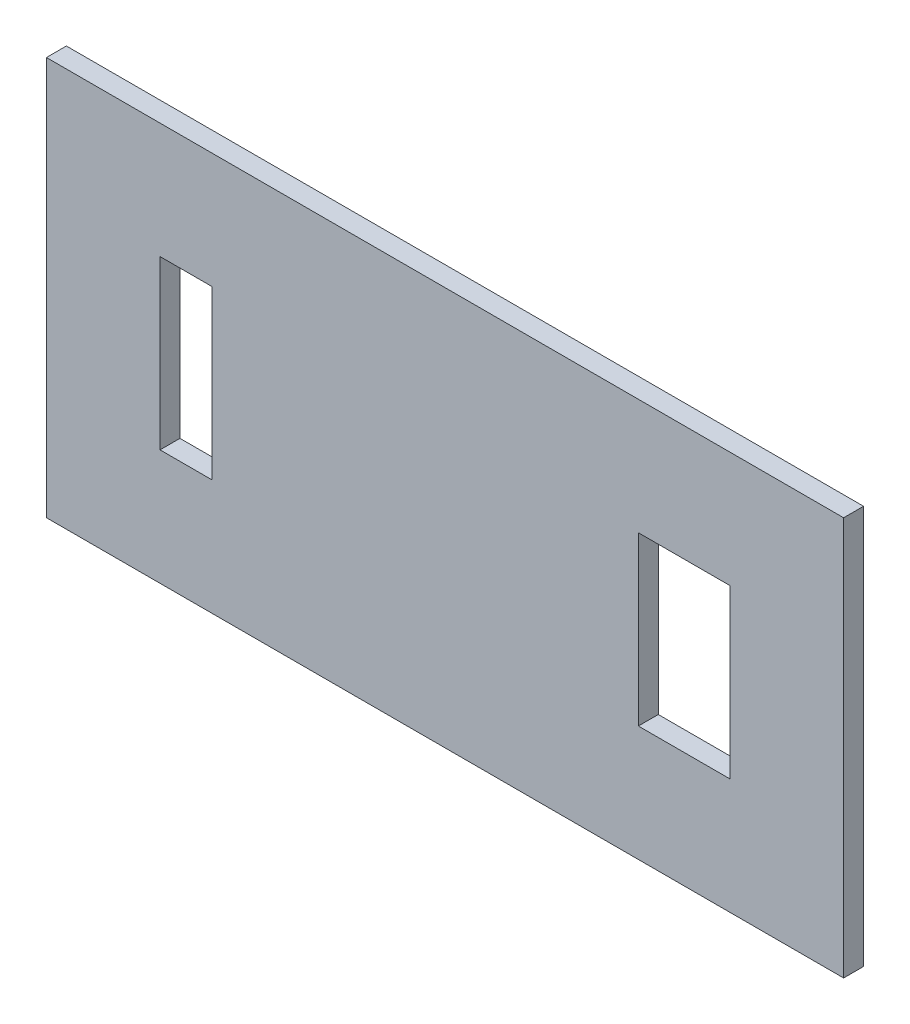
ISO-10303-21;
HEADER;
FILE_DESCRIPTION(('STEP AP214'),'2;1');
FILE_NAME('part.step','',(''),(''),'','','');
FILE_SCHEMA(('AUTOMOTIVE_DESIGN { 1 0 10303 214 1 1 1 1 }'));
ENDSEC;
DATA;
#1=APPLICATION_CONTEXT('core data for automotive mechanical design processes');
#2=APPLICATION_PROTOCOL_DEFINITION('international standard','automotive_design',2000,#1);
#3=PRODUCT_CONTEXT('',#1,'mechanical');
#4=PRODUCT('Part','Part','',(#3));
#5=PRODUCT_RELATED_PRODUCT_CATEGORY('part','',(#4));
#6=PRODUCT_DEFINITION_FORMATION('','',#4);
#7=PRODUCT_DEFINITION_CONTEXT('part definition',#1,'design');
#8=PRODUCT_DEFINITION('design','',#6,#7);
#9=PRODUCT_DEFINITION_SHAPE('','',#8);
#10=(LENGTH_UNIT() NAMED_UNIT(*) SI_UNIT(.MILLI.,.METRE.));
#11=(NAMED_UNIT(*) PLANE_ANGLE_UNIT() SI_UNIT($,.RADIAN.));
#12=(NAMED_UNIT(*) SI_UNIT($,.STERADIAN.) SOLID_ANGLE_UNIT());
#13=UNCERTAINTY_MEASURE_WITH_UNIT(LENGTH_MEASURE(1.E-05),#10,'distance_accuracy_value','');
#14=(GEOMETRIC_REPRESENTATION_CONTEXT(3) GLOBAL_UNCERTAINTY_ASSIGNED_CONTEXT((#13)) GLOBAL_UNIT_ASSIGNED_CONTEXT((#10,
#11,#12)) REPRESENTATION_CONTEXT('',''));
#15=CARTESIAN_POINT('',(0.,0.,0.));
#16=DIRECTION('',(0.,0.,1.));
#17=DIRECTION('',(1.,0.,0.));
#18=AXIS2_PLACEMENT_3D('',#15,#16,#17);
#19=CARTESIAN_POINT('',(0.,0.,1.27));
#20=DIRECTION('',(0.,0.,1.));
#21=DIRECTION('',(1.,0.,0.));
#22=AXIS2_PLACEMENT_3D('',#19,#20,#21);
#23=PLANE('',#22);
#24=DIRECTION('',(-1.,0.,0.));
#25=VECTOR('',#24,1.);
#26=CARTESIAN_POINT('',(12.319,5.33400000000001,1.27));
#27=LINE('',#26,#25);
#28=CARTESIAN_POINT('',(18.161,5.33400000000001,1.27));
#29=VERTEX_POINT('',#28);
#30=CARTESIAN_POINT('',(12.319,5.33400000000001,1.27));
#31=VERTEX_POINT('',#30);
#32=EDGE_CURVE('E160',#29,#31,#27,.T.);
#33=ORIENTED_EDGE('',*,*,#32,.F.);
#34=DIRECTION('',(0.,1.,0.));
#35=VECTOR('',#34,1.);
#36=CARTESIAN_POINT('',(18.161,5.33400000000001,1.27));
#37=LINE('',#36,#35);
#38=CARTESIAN_POINT('',(18.161,-5.33399999999999,1.27));
#39=VERTEX_POINT('',#38);
#40=EDGE_CURVE('E158',#39,#29,#37,.T.);
#41=ORIENTED_EDGE('',*,*,#40,.F.);
#42=DIRECTION('',(1.,0.,0.));
#43=VECTOR('',#42,1.);
#44=CARTESIAN_POINT('',(12.319,-5.33399999999999,1.27));
#45=LINE('',#44,#43);
#46=CARTESIAN_POINT('',(12.319,-5.33399999999999,1.27));
#47=VERTEX_POINT('',#46);
#48=EDGE_CURVE('E166',#47,#39,#45,.T.);
#49=ORIENTED_EDGE('',*,*,#48,.F.);
#50=DIRECTION('',(0.,-1.,0.));
#51=VECTOR('',#50,1.);
#52=CARTESIAN_POINT('',(12.319,5.33400000000001,1.27));
#53=LINE('',#52,#51);
#54=EDGE_CURVE('E163',#31,#47,#53,.T.);
#55=ORIENTED_EDGE('',*,*,#54,.F.);
#56=EDGE_LOOP('',(#33,#41,#49,#55));
#57=FACE_BOUND('',#56,.T.);
#58=DIRECTION('',(0.,1.,0.));
#59=VECTOR('',#58,1.);
#60=CARTESIAN_POINT('',(25.4,12.7,1.27));
#61=LINE('',#60,#59);
#62=CARTESIAN_POINT('',(25.4,-12.7,1.27));
#63=VERTEX_POINT('',#62);
#64=CARTESIAN_POINT('',(25.4,12.7,1.27));
#65=VERTEX_POINT('',#64);
#66=EDGE_CURVE('E189',#63,#65,#61,.T.);
#67=ORIENTED_EDGE('',*,*,#66,.T.);
#68=DIRECTION('',(-1.,0.,0.));
#69=VECTOR('',#68,1.);
#70=CARTESIAN_POINT('',(-25.4,12.7,1.27));
#71=LINE('',#70,#69);
#72=CARTESIAN_POINT('',(-25.4,12.7,1.27));
#73=VERTEX_POINT('',#72);
#74=EDGE_CURVE('E192',#65,#73,#71,.T.);
#75=ORIENTED_EDGE('',*,*,#74,.T.);
#76=DIRECTION('',(0.,-1.,0.));
#77=VECTOR('',#76,1.);
#78=CARTESIAN_POINT('',(-25.4,12.7,1.27));
#79=LINE('',#78,#77);
#80=CARTESIAN_POINT('',(-25.4,-12.7,1.27));
#81=VERTEX_POINT('',#80);
#82=EDGE_CURVE('E195',#73,#81,#79,.T.);
#83=ORIENTED_EDGE('',*,*,#82,.T.);
#84=DIRECTION('',(1.,0.,0.));
#85=VECTOR('',#84,1.);
#86=CARTESIAN_POINT('',(-25.4,-12.7,1.27));
#87=LINE('',#86,#85);
#88=EDGE_CURVE('E197',#81,#63,#87,.T.);
#89=ORIENTED_EDGE('',*,*,#88,.T.);
#90=EDGE_LOOP('',(#67,#75,#83,#89));
#91=FACE_BOUND('',#90,.T.);
#92=DIRECTION('',(1.,0.,0.));
#93=VECTOR('',#92,1.);
#94=CARTESIAN_POINT('',(-14.859,-5.33399999999999,1.27));
#95=LINE('',#94,#93);
#96=CARTESIAN_POINT('',(-18.161,-5.334,1.27));
#97=VERTEX_POINT('',#96);
#98=CARTESIAN_POINT('',(-14.859,-5.33399999999999,1.27));
#99=VERTEX_POINT('',#98);
#100=EDGE_CURVE('E130',#97,#99,#95,.T.);
#101=ORIENTED_EDGE('',*,*,#100,.F.);
#102=DIRECTION('',(0.,-1.,0.));
#103=VECTOR('',#102,1.);
#104=CARTESIAN_POINT('',(-18.161,5.334,1.27));
#105=LINE('',#104,#103);
#106=CARTESIAN_POINT('',(-18.161,5.334,1.27));
#107=VERTEX_POINT('',#106);
#108=EDGE_CURVE('E122',#107,#97,#105,.T.);
#109=ORIENTED_EDGE('',*,*,#108,.F.);
#110=DIRECTION('',(-1.,0.,0.));
#111=VECTOR('',#110,1.);
#112=CARTESIAN_POINT('',(-14.859,5.334,1.27));
#113=LINE('',#112,#111);
#114=CARTESIAN_POINT('',(-14.859,5.334,1.27));
#115=VERTEX_POINT('',#114);
#116=EDGE_CURVE('E144',#115,#107,#113,.T.);
#117=ORIENTED_EDGE('',*,*,#116,.F.);
#118=DIRECTION('',(0.,1.,0.));
#119=VECTOR('',#118,1.);
#120=CARTESIAN_POINT('',(-14.859,5.334,1.27));
#121=LINE('',#120,#119);
#122=EDGE_CURVE('E142',#99,#115,#121,.T.);
#123=ORIENTED_EDGE('',*,*,#122,.F.);
#124=EDGE_LOOP('',(#101,#109,#117,#123));
#125=FACE_BOUND('',#124,.T.);
#126=ADVANCED_FACE('F33',(#57,#91,#125),#23,.T.);
#127=CARTESIAN_POINT('',(0.,0.,0.));
#128=DIRECTION('',(0.,0.,1.));
#129=DIRECTION('',(1.,0.,0.));
#130=AXIS2_PLACEMENT_3D('',#127,#128,#129);
#131=PLANE('',#130);
#132=DIRECTION('',(0.,1.,0.));
#133=VECTOR('',#132,1.);
#134=CARTESIAN_POINT('',(18.161,5.33400000000001,0.));
#135=LINE('',#134,#133);
#136=CARTESIAN_POINT('',(18.161,-5.33399999999999,0.));
#137=VERTEX_POINT('',#136);
#138=CARTESIAN_POINT('',(18.161,5.33400000000001,0.));
#139=VERTEX_POINT('',#138);
#140=EDGE_CURVE('E138',#137,#139,#135,.T.);
#141=ORIENTED_EDGE('',*,*,#140,.T.);
#142=DIRECTION('',(-1.,0.,0.));
#143=VECTOR('',#142,1.);
#144=CARTESIAN_POINT('',(12.319,5.33400000000001,0.));
#145=LINE('',#144,#143);
#146=CARTESIAN_POINT('',(12.319,5.33400000000001,0.));
#147=VERTEX_POINT('',#146);
#148=EDGE_CURVE('E171',#139,#147,#145,.T.);
#149=ORIENTED_EDGE('',*,*,#148,.T.);
#150=DIRECTION('',(0.,-1.,0.));
#151=VECTOR('',#150,1.);
#152=CARTESIAN_POINT('',(12.319,5.33400000000001,0.));
#153=LINE('',#152,#151);
#154=CARTESIAN_POINT('',(12.319,-5.33399999999999,0.));
#155=VERTEX_POINT('',#154);
#156=EDGE_CURVE('E174',#147,#155,#153,.T.);
#157=ORIENTED_EDGE('',*,*,#156,.T.);
#158=DIRECTION('',(1.,0.,0.));
#159=VECTOR('',#158,1.);
#160=CARTESIAN_POINT('',(12.319,-5.33399999999999,0.));
#161=LINE('',#160,#159);
#162=EDGE_CURVE('E161',#155,#137,#161,.T.);
#163=ORIENTED_EDGE('',*,*,#162,.T.);
#164=EDGE_LOOP('',(#141,#149,#157,#163));
#165=FACE_BOUND('',#164,.T.);
#166=DIRECTION('',(0.,1.,0.));
#167=VECTOR('',#166,1.);
#168=CARTESIAN_POINT('',(25.4,12.7,0.));
#169=LINE('',#168,#167);
#170=CARTESIAN_POINT('',(25.4,-12.7,0.));
#171=VERTEX_POINT('',#170);
#172=CARTESIAN_POINT('',(25.4,12.7,0.));
#173=VERTEX_POINT('',#172);
#174=EDGE_CURVE('E188',#171,#173,#169,.T.);
#175=ORIENTED_EDGE('',*,*,#174,.F.);
#176=DIRECTION('',(1.,0.,0.));
#177=VECTOR('',#176,1.);
#178=CARTESIAN_POINT('',(-25.4,-12.7,0.));
#179=LINE('',#178,#177);
#180=CARTESIAN_POINT('',(-25.4,-12.7,0.));
#181=VERTEX_POINT('',#180);
#182=EDGE_CURVE('E193',#181,#171,#179,.T.);
#183=ORIENTED_EDGE('',*,*,#182,.F.);
#184=DIRECTION('',(0.,-1.,0.));
#185=VECTOR('',#184,1.);
#186=CARTESIAN_POINT('',(-25.4,12.7,0.));
#187=LINE('',#186,#185);
#188=CARTESIAN_POINT('',(-25.4,12.7,0.));
#189=VERTEX_POINT('',#188);
#190=EDGE_CURVE('E204',#189,#181,#187,.T.);
#191=ORIENTED_EDGE('',*,*,#190,.F.);
#192=DIRECTION('',(-1.,0.,0.));
#193=VECTOR('',#192,1.);
#194=CARTESIAN_POINT('',(-25.4,12.7,0.));
#195=LINE('',#194,#193);
#196=EDGE_CURVE('E202',#173,#189,#195,.T.);
#197=ORIENTED_EDGE('',*,*,#196,.F.);
#198=EDGE_LOOP('',(#175,#183,#191,#197));
#199=FACE_BOUND('',#198,.T.);
#200=DIRECTION('',(0.,-1.,0.));
#201=VECTOR('',#200,1.);
#202=CARTESIAN_POINT('',(-18.161,5.334,0.));
#203=LINE('',#202,#201);
#204=CARTESIAN_POINT('',(-18.161,5.334,0.));
#205=VERTEX_POINT('',#204);
#206=CARTESIAN_POINT('',(-18.161,-5.334,0.));
#207=VERTEX_POINT('',#206);
#208=EDGE_CURVE('E56',#205,#207,#203,.T.);
#209=ORIENTED_EDGE('',*,*,#208,.T.);
#210=DIRECTION('',(1.,0.,0.));
#211=VECTOR('',#210,1.);
#212=CARTESIAN_POINT('',(-14.859,-5.33399999999999,0.));
#213=LINE('',#212,#211);
#214=CARTESIAN_POINT('',(-14.859,-5.33399999999999,0.));
#215=VERTEX_POINT('',#214);
#216=EDGE_CURVE('E137',#207,#215,#213,.T.);
#217=ORIENTED_EDGE('',*,*,#216,.T.);
#218=DIRECTION('',(0.,1.,0.));
#219=VECTOR('',#218,1.);
#220=CARTESIAN_POINT('',(-14.859,5.334,0.));
#221=LINE('',#220,#219);
#222=CARTESIAN_POINT('',(-14.859,5.334,0.));
#223=VERTEX_POINT('',#222);
#224=EDGE_CURVE('E150',#215,#223,#221,.T.);
#225=ORIENTED_EDGE('',*,*,#224,.T.);
#226=DIRECTION('',(-1.,0.,0.));
#227=VECTOR('',#226,1.);
#228=CARTESIAN_POINT('',(-14.859,5.334,0.));
#229=LINE('',#228,#227);
#230=EDGE_CURVE('E131',#223,#205,#229,.T.);
#231=ORIENTED_EDGE('',*,*,#230,.T.);
#232=EDGE_LOOP('',(#209,#217,#225,#231));
#233=FACE_BOUND('',#232,.T.);
#234=ADVANCED_FACE('F222',(#165,#199,#233),#131,.F.);
#235=CARTESIAN_POINT('',(25.4,12.7,1.27));
#236=DIRECTION('',(-1.,0.,0.));
#237=DIRECTION('',(0.,-1.,0.));
#238=AXIS2_PLACEMENT_3D('',#235,#236,#237);
#239=PLANE('',#238);
#240=ORIENTED_EDGE('',*,*,#174,.T.);
#241=DIRECTION('',(0.,0.,-1.));
#242=VECTOR('',#241,1.);
#243=CARTESIAN_POINT('',(25.4,12.7,1.27));
#244=LINE('',#243,#242);
#245=EDGE_CURVE('E11',#65,#173,#244,.T.);
#246=ORIENTED_EDGE('',*,*,#245,.F.);
#247=ORIENTED_EDGE('',*,*,#66,.F.);
#248=DIRECTION('',(0.,0.,-1.));
#249=VECTOR('',#248,1.);
#250=CARTESIAN_POINT('',(25.4,-12.7,1.27));
#251=LINE('',#250,#249);
#252=EDGE_CURVE('E199',#63,#171,#251,.T.);
#253=ORIENTED_EDGE('',*,*,#252,.T.);
#254=EDGE_LOOP('',(#240,#246,#247,#253));
#255=FACE_BOUND('',#254,.T.);
#256=ADVANCED_FACE('F35',(#255),#239,.F.);
#257=CARTESIAN_POINT('',(-25.4,12.7,1.27));
#258=DIRECTION('',(0.,-1.,0.));
#259=DIRECTION('',(0.,0.,-1.));
#260=AXIS2_PLACEMENT_3D('',#257,#258,#259);
#261=PLANE('',#260);
#262=ORIENTED_EDGE('',*,*,#196,.T.);
#263=DIRECTION('',(0.,0.,-1.));
#264=VECTOR('',#263,1.);
#265=CARTESIAN_POINT('',(-25.4,12.7,1.27));
#266=LINE('',#265,#264);
#267=EDGE_CURVE('E41',#73,#189,#266,.T.);
#268=ORIENTED_EDGE('',*,*,#267,.F.);
#269=ORIENTED_EDGE('',*,*,#74,.F.);
#270=ORIENTED_EDGE('',*,*,#245,.T.);
#271=EDGE_LOOP('',(#262,#268,#269,#270));
#272=FACE_BOUND('',#271,.T.);
#273=ADVANCED_FACE('F232',(#272),#261,.F.);
#274=CARTESIAN_POINT('',(-25.4,12.7,1.27));
#275=DIRECTION('',(1.,0.,0.));
#276=DIRECTION('',(0.,1.,0.));
#277=AXIS2_PLACEMENT_3D('',#274,#275,#276);
#278=PLANE('',#277);
#279=ORIENTED_EDGE('',*,*,#190,.T.);
#280=DIRECTION('',(0.,0.,-1.));
#281=VECTOR('',#280,1.);
#282=CARTESIAN_POINT('',(-25.4,-12.7,1.27));
#283=LINE('',#282,#281);
#284=EDGE_CURVE('E209',#81,#181,#283,.T.);
#285=ORIENTED_EDGE('',*,*,#284,.F.);
#286=ORIENTED_EDGE('',*,*,#82,.F.);
#287=ORIENTED_EDGE('',*,*,#267,.T.);
#288=EDGE_LOOP('',(#279,#285,#286,#287));
#289=FACE_BOUND('',#288,.T.);
#290=ADVANCED_FACE('F216',(#289),#278,.F.);
#291=CARTESIAN_POINT('',(-25.4,-12.7,1.27));
#292=DIRECTION('',(0.,1.,0.));
#293=DIRECTION('',(0.,0.,1.));
#294=AXIS2_PLACEMENT_3D('',#291,#292,#293);
#295=PLANE('',#294);
#296=ORIENTED_EDGE('',*,*,#182,.T.);
#297=ORIENTED_EDGE('',*,*,#252,.F.);
#298=ORIENTED_EDGE('',*,*,#88,.F.);
#299=ORIENTED_EDGE('',*,*,#284,.T.);
#300=EDGE_LOOP('',(#296,#297,#298,#299));
#301=FACE_BOUND('',#300,.T.);
#302=ADVANCED_FACE('F226',(#301),#295,.F.);
#303=CARTESIAN_POINT('',(18.161,5.33400000000001,1.27));
#304=DIRECTION('',(-1.,0.,0.));
#305=DIRECTION('',(0.,-1.,0.));
#306=AXIS2_PLACEMENT_3D('',#303,#304,#305);
#307=PLANE('',#306);
#308=ORIENTED_EDGE('',*,*,#140,.F.);
#309=DIRECTION('',(0.,0.,-1.));
#310=VECTOR('',#309,1.);
#311=CARTESIAN_POINT('',(18.161,-5.33399999999999,1.27));
#312=LINE('',#311,#310);
#313=EDGE_CURVE('E168',#39,#137,#312,.T.);
#314=ORIENTED_EDGE('',*,*,#313,.F.);
#315=ORIENTED_EDGE('',*,*,#40,.T.);
#316=DIRECTION('',(0.,0.,-1.));
#317=VECTOR('',#316,1.);
#318=CARTESIAN_POINT('',(18.161,5.33400000000001,1.27));
#319=LINE('',#318,#317);
#320=EDGE_CURVE('E185',#29,#139,#319,.T.);
#321=ORIENTED_EDGE('',*,*,#320,.T.);
#322=EDGE_LOOP('',(#308,#314,#315,#321));
#323=FACE_BOUND('',#322,.T.);
#324=ADVANCED_FACE('F249',(#323),#307,.T.);
#325=CARTESIAN_POINT('',(12.319,5.33400000000001,1.27));
#326=DIRECTION('',(0.,-1.,0.));
#327=DIRECTION('',(1.,0.,0.));
#328=AXIS2_PLACEMENT_3D('',#325,#326,#327);
#329=PLANE('',#328);
#330=ORIENTED_EDGE('',*,*,#148,.F.);
#331=ORIENTED_EDGE('',*,*,#320,.F.);
#332=ORIENTED_EDGE('',*,*,#32,.T.);
#333=DIRECTION('',(0.,0.,-1.));
#334=VECTOR('',#333,1.);
#335=CARTESIAN_POINT('',(12.319,5.33400000000001,1.27));
#336=LINE('',#335,#334);
#337=EDGE_CURVE('E183',#31,#147,#336,.T.);
#338=ORIENTED_EDGE('',*,*,#337,.T.);
#339=EDGE_LOOP('',(#330,#331,#332,#338));
#340=FACE_BOUND('',#339,.T.);
#341=ADVANCED_FACE('F256',(#340),#329,.T.);
#342=CARTESIAN_POINT('',(12.319,5.33400000000001,1.27));
#343=DIRECTION('',(1.,0.,0.));
#344=DIRECTION('',(0.,0.,-1.));
#345=AXIS2_PLACEMENT_3D('',#342,#343,#344);
#346=PLANE('',#345);
#347=ORIENTED_EDGE('',*,*,#156,.F.);
#348=ORIENTED_EDGE('',*,*,#337,.F.);
#349=ORIENTED_EDGE('',*,*,#54,.T.);
#350=DIRECTION('',(0.,0.,-1.));
#351=VECTOR('',#350,1.);
#352=CARTESIAN_POINT('',(12.319,-5.33399999999999,1.27));
#353=LINE('',#352,#351);
#354=EDGE_CURVE('E181',#47,#155,#353,.T.);
#355=ORIENTED_EDGE('',*,*,#354,.T.);
#356=EDGE_LOOP('',(#347,#348,#349,#355));
#357=FACE_BOUND('',#356,.T.);
#358=ADVANCED_FACE('F261',(#357),#346,.T.);
#359=CARTESIAN_POINT('',(12.319,-5.33399999999999,1.27));
#360=DIRECTION('',(0.,1.,0.));
#361=DIRECTION('',(-1.,0.,0.));
#362=AXIS2_PLACEMENT_3D('',#359,#360,#361);
#363=PLANE('',#362);
#364=ORIENTED_EDGE('',*,*,#162,.F.);
#365=ORIENTED_EDGE('',*,*,#354,.F.);
#366=ORIENTED_EDGE('',*,*,#48,.T.);
#367=ORIENTED_EDGE('',*,*,#313,.T.);
#368=EDGE_LOOP('',(#364,#365,#366,#367));
#369=FACE_BOUND('',#368,.T.);
#370=ADVANCED_FACE('F268',(#369),#363,.T.);
#371=CARTESIAN_POINT('',(-18.161,5.334,1.27));
#372=DIRECTION('',(1.,0.,0.));
#373=DIRECTION('',(0.,0.,-1.));
#374=AXIS2_PLACEMENT_3D('',#371,#372,#373);
#375=PLANE('',#374);
#376=ORIENTED_EDGE('',*,*,#208,.F.);
#377=DIRECTION('',(0.,0.,-1.));
#378=VECTOR('',#377,1.);
#379=CARTESIAN_POINT('',(-18.161,5.334,1.27));
#380=LINE('',#379,#378);
#381=EDGE_CURVE('E126',#107,#205,#380,.T.);
#382=ORIENTED_EDGE('',*,*,#381,.F.);
#383=ORIENTED_EDGE('',*,*,#108,.T.);
#384=DIRECTION('',(0.,0.,-1.));
#385=VECTOR('',#384,1.);
#386=CARTESIAN_POINT('',(-18.161,-5.334,1.27));
#387=LINE('',#386,#385);
#388=EDGE_CURVE('E125',#97,#207,#387,.T.);
#389=ORIENTED_EDGE('',*,*,#388,.T.);
#390=EDGE_LOOP('',(#376,#382,#383,#389));
#391=FACE_BOUND('',#390,.T.);
#392=ADVANCED_FACE('F124',(#391),#375,.T.);
#393=CARTESIAN_POINT('',(-14.859,-5.33399999999999,1.27));
#394=DIRECTION('',(0.,1.,0.));
#395=DIRECTION('',(-1.,0.,0.));
#396=AXIS2_PLACEMENT_3D('',#393,#394,#395);
#397=PLANE('',#396);
#398=ORIENTED_EDGE('',*,*,#216,.F.);
#399=ORIENTED_EDGE('',*,*,#388,.F.);
#400=ORIENTED_EDGE('',*,*,#100,.T.);
#401=DIRECTION('',(0.,0.,-1.));
#402=VECTOR('',#401,1.);
#403=CARTESIAN_POINT('',(-14.859,-5.33399999999999,1.27));
#404=LINE('',#403,#402);
#405=EDGE_CURVE('E139',#99,#215,#404,.T.);
#406=ORIENTED_EDGE('',*,*,#405,.T.);
#407=EDGE_LOOP('',(#398,#399,#400,#406));
#408=FACE_BOUND('',#407,.T.);
#409=ADVANCED_FACE('F134',(#408),#397,.T.);
#410=CARTESIAN_POINT('',(-14.859,5.334,1.27));
#411=DIRECTION('',(-1.,0.,0.));
#412=DIRECTION('',(0.,-1.,0.));
#413=AXIS2_PLACEMENT_3D('',#410,#411,#412);
#414=PLANE('',#413);
#415=ORIENTED_EDGE('',*,*,#224,.F.);
#416=ORIENTED_EDGE('',*,*,#405,.F.);
#417=ORIENTED_EDGE('',*,*,#122,.T.);
#418=DIRECTION('',(0.,0.,-1.));
#419=VECTOR('',#418,1.);
#420=CARTESIAN_POINT('',(-14.859,5.334,1.27));
#421=LINE('',#420,#419);
#422=EDGE_CURVE('E48',#115,#223,#421,.T.);
#423=ORIENTED_EDGE('',*,*,#422,.T.);
#424=EDGE_LOOP('',(#415,#416,#417,#423));
#425=FACE_BOUND('',#424,.T.);
#426=ADVANCED_FACE('F285',(#425),#414,.T.);
#427=CARTESIAN_POINT('',(-14.859,5.334,1.27));
#428=DIRECTION('',(0.,-1.,0.));
#429=DIRECTION('',(1.,0.,0.));
#430=AXIS2_PLACEMENT_3D('',#427,#428,#429);
#431=PLANE('',#430);
#432=ORIENTED_EDGE('',*,*,#230,.F.);
#433=ORIENTED_EDGE('',*,*,#422,.F.);
#434=ORIENTED_EDGE('',*,*,#116,.T.);
#435=ORIENTED_EDGE('',*,*,#381,.T.);
#436=EDGE_LOOP('',(#432,#433,#434,#435));
#437=FACE_BOUND('',#436,.T.);
#438=ADVANCED_FACE('F288',(#437),#431,.T.);
#439=CLOSED_SHELL('',(#126,#234,#256,#273,#290,#302,#324,#341,#358,#370,#392,#409,#426,#438));
#440=MANIFOLD_SOLID_BREP('B2',#439);
#441=ADVANCED_BREP_SHAPE_REPRESENTATION('',(#18,#440),#14);
#442=SHAPE_DEFINITION_REPRESENTATION(#9,#441);
ENDSEC;
END-ISO-10303-21;
